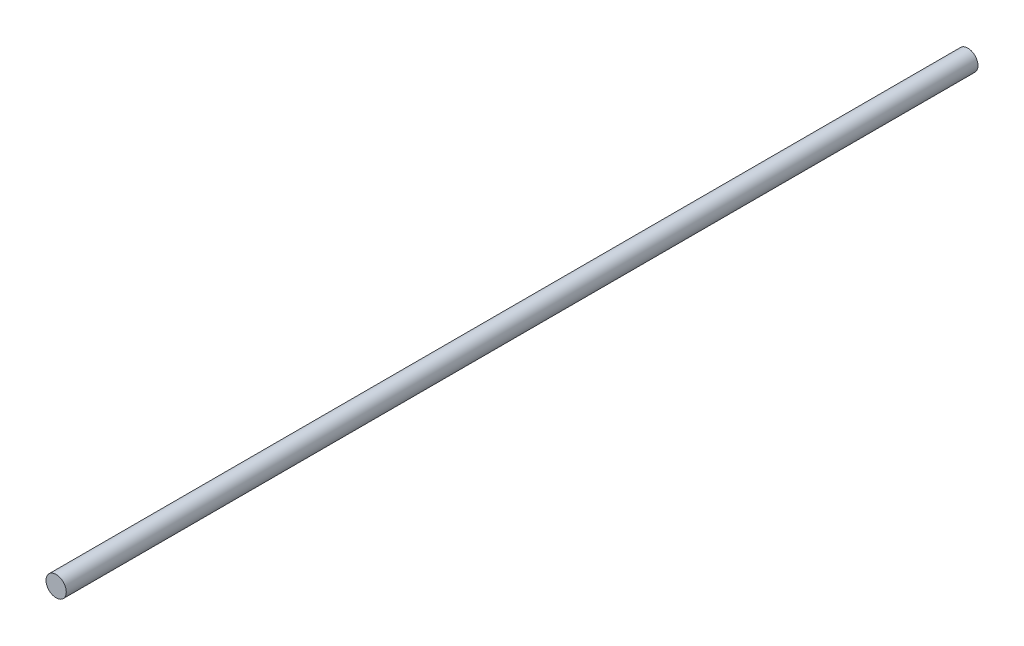
ISO-10303-21;
HEADER;
FILE_DESCRIPTION(('STEP AP214'),'2;1');
FILE_NAME('part.step','',(''),(''),'','','');
FILE_SCHEMA(('AUTOMOTIVE_DESIGN { 1 0 10303 214 1 1 1 1 }'));
ENDSEC;
DATA;
#1=APPLICATION_CONTEXT('core data for automotive mechanical design processes');
#2=APPLICATION_PROTOCOL_DEFINITION('international standard','automotive_design',2000,#1);
#3=PRODUCT_CONTEXT('',#1,'mechanical');
#4=PRODUCT('Part','Part','',(#3));
#5=PRODUCT_RELATED_PRODUCT_CATEGORY('part','',(#4));
#6=PRODUCT_DEFINITION_FORMATION('','',#4);
#7=PRODUCT_DEFINITION_CONTEXT('part definition',#1,'design');
#8=PRODUCT_DEFINITION('design','',#6,#7);
#9=PRODUCT_DEFINITION_SHAPE('','',#8);
#10=(LENGTH_UNIT() NAMED_UNIT(*) SI_UNIT(.MILLI.,.METRE.));
#11=(NAMED_UNIT(*) PLANE_ANGLE_UNIT() SI_UNIT($,.RADIAN.));
#12=(NAMED_UNIT(*) SI_UNIT($,.STERADIAN.) SOLID_ANGLE_UNIT());
#13=UNCERTAINTY_MEASURE_WITH_UNIT(LENGTH_MEASURE(1.E-05),#10,'distance_accuracy_value','');
#14=(GEOMETRIC_REPRESENTATION_CONTEXT(3) GLOBAL_UNCERTAINTY_ASSIGNED_CONTEXT((#13)) GLOBAL_UNIT_ASSIGNED_CONTEXT((#10,
#11,#12)) REPRESENTATION_CONTEXT('',''));
#15=CARTESIAN_POINT('',(0.,0.,0.));
#16=DIRECTION('',(0.,0.,1.));
#17=DIRECTION('',(1.,0.,0.));
#18=AXIS2_PLACEMENT_3D('',#15,#16,#17);
#19=CARTESIAN_POINT('',(0.,0.,449.));
#20=DIRECTION('',(0.,0.,-1.));
#21=DIRECTION('',(-1.,0.,0.));
#22=AXIS2_PLACEMENT_3D('',#19,#20,#21);
#23=CYLINDRICAL_SURFACE('',#22,5.);
#24=CARTESIAN_POINT('',(0.,0.,449.));
#25=DIRECTION('',(0.,0.,1.));
#26=DIRECTION('',(1.,0.,0.));
#27=AXIS2_PLACEMENT_3D('',#24,#25,#26);
#28=CIRCLE('',#27,5.);
#29=CARTESIAN_POINT('',(5.,0.,449.));
#30=VERTEX_POINT('',#29);
#31=EDGE_CURVE('E10',#30,#30,#28,.T.);
#32=ORIENTED_EDGE('',*,*,#31,.F.);
#33=EDGE_LOOP('',(#32));
#34=FACE_BOUND('',#33,.T.);
#35=CARTESIAN_POINT('',(0.,0.,0.));
#36=DIRECTION('',(0.,0.,1.));
#37=DIRECTION('',(1.,0.,0.));
#38=AXIS2_PLACEMENT_3D('',#35,#36,#37);
#39=CIRCLE('',#38,5.);
#40=CARTESIAN_POINT('',(5.,0.,0.));
#41=VERTEX_POINT('',#40);
#42=EDGE_CURVE('E33',#41,#41,#39,.T.);
#43=ORIENTED_EDGE('',*,*,#42,.T.);
#44=EDGE_LOOP('',(#43));
#45=FACE_BOUND('',#44,.T.);
#46=ADVANCED_FACE('F30',(#34,#45),#23,.T.);
#47=CARTESIAN_POINT('',(0.,0.,449.));
#48=DIRECTION('',(0.,0.,1.));
#49=DIRECTION('',(1.,0.,0.));
#50=AXIS2_PLACEMENT_3D('',#47,#48,#49);
#51=PLANE('',#50);
#52=ORIENTED_EDGE('',*,*,#31,.T.);
#53=EDGE_LOOP('',(#52));
#54=FACE_BOUND('',#53,.T.);
#55=ADVANCED_FACE('F45',(#54),#51,.T.);
#56=CARTESIAN_POINT('',(0.,0.,0.));
#57=DIRECTION('',(0.,0.,1.));
#58=DIRECTION('',(1.,0.,0.));
#59=AXIS2_PLACEMENT_3D('',#56,#57,#58);
#60=PLANE('',#59);
#61=ORIENTED_EDGE('',*,*,#42,.F.);
#62=EDGE_LOOP('',(#61));
#63=FACE_BOUND('',#62,.T.);
#64=ADVANCED_FACE('F43',(#63),#60,.F.);
#65=CLOSED_SHELL('',(#46,#55,#64));
#66=MANIFOLD_SOLID_BREP('B2',#65);
#67=ADVANCED_BREP_SHAPE_REPRESENTATION('',(#18,#66),#14);
#68=SHAPE_DEFINITION_REPRESENTATION(#9,#67);
ENDSEC;
END-ISO-10303-21;
